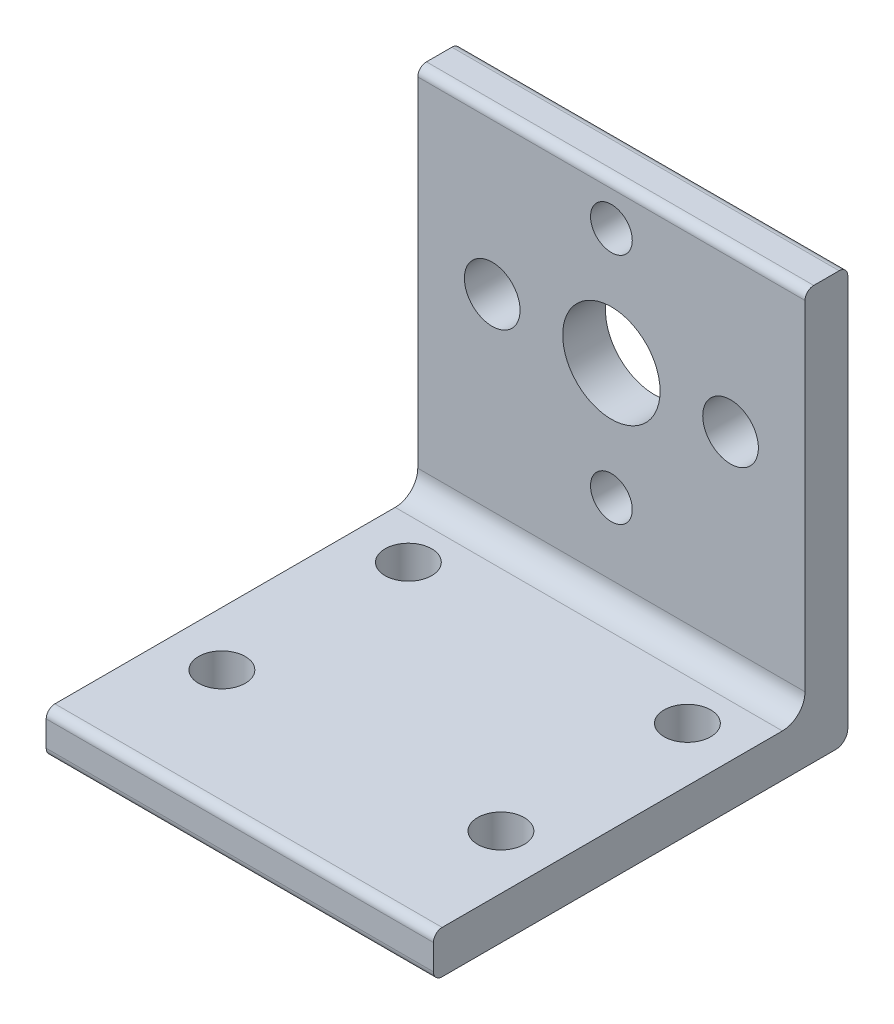
ISO-10303-21;
HEADER;
FILE_DESCRIPTION(('STEP AP214'),'2;1');
FILE_NAME('part.step','',(''),(''),'','','');
FILE_SCHEMA(('AUTOMOTIVE_DESIGN { 1 0 10303 214 1 1 1 1 }'));
ENDSEC;
DATA;
#1=APPLICATION_CONTEXT('core data for automotive mechanical design processes');
#2=APPLICATION_PROTOCOL_DEFINITION('international standard','automotive_design',2000,#1);
#3=PRODUCT_CONTEXT('',#1,'mechanical');
#4=PRODUCT('Part','Part','',(#3));
#5=PRODUCT_RELATED_PRODUCT_CATEGORY('part','',(#4));
#6=PRODUCT_DEFINITION_FORMATION('','',#4);
#7=PRODUCT_DEFINITION_CONTEXT('part definition',#1,'design');
#8=PRODUCT_DEFINITION('design','',#6,#7);
#9=PRODUCT_DEFINITION_SHAPE('','',#8);
#10=(LENGTH_UNIT() NAMED_UNIT(*) SI_UNIT(.MILLI.,.METRE.));
#11=(NAMED_UNIT(*) PLANE_ANGLE_UNIT() SI_UNIT($,.RADIAN.));
#12=(NAMED_UNIT(*) SI_UNIT($,.STERADIAN.) SOLID_ANGLE_UNIT());
#13=UNCERTAINTY_MEASURE_WITH_UNIT(LENGTH_MEASURE(1.E-05),#10,'distance_accuracy_value','');
#14=(GEOMETRIC_REPRESENTATION_CONTEXT(3) GLOBAL_UNCERTAINTY_ASSIGNED_CONTEXT((#13)) GLOBAL_UNIT_ASSIGNED_CONTEXT((#10,
#11,#12)) REPRESENTATION_CONTEXT('',''));
#15=CARTESIAN_POINT('',(0.,0.,0.));
#16=DIRECTION('',(0.,0.,1.));
#17=DIRECTION('',(1.,0.,0.));
#18=AXIS2_PLACEMENT_3D('',#15,#16,#17);
#19=CARTESIAN_POINT('',(28.2702,0.,3.1242));
#20=DIRECTION('',(0.,-1.,0.));
#21=DIRECTION('',(0.,0.,-1.));
#22=AXIS2_PLACEMENT_3D('',#19,#20,#21);
#23=PLANE('',#22);
#24=DIRECTION('',(0.,0.,1.));
#25=VECTOR('',#24,1.);
#26=CARTESIAN_POINT('',(28.2702,0.,3.1242));
#27=LINE('',#26,#25);
#28=CARTESIAN_POINT('',(28.2702,0.,0.635));
#29=VERTEX_POINT('',#28);
#30=CARTESIAN_POINT('',(28.2702,0.,2.4892));
#31=VERTEX_POINT('',#30);
#32=EDGE_CURVE('E192',#29,#31,#27,.T.);
#33=ORIENTED_EDGE('',*,*,#32,.F.);
#34=DIRECTION('',(-1.,0.,0.));
#35=VECTOR('',#34,1.);
#36=CARTESIAN_POINT('',(28.2702,0.,0.635));
#37=LINE('',#36,#35);
#38=CARTESIAN_POINT('',(0.,0.,0.635));
#39=VERTEX_POINT('',#38);
#40=EDGE_CURVE('E239',#29,#39,#37,.T.);
#41=ORIENTED_EDGE('',*,*,#40,.T.);
#42=DIRECTION('',(0.,0.,1.));
#43=VECTOR('',#42,1.);
#44=CARTESIAN_POINT('',(0.,0.,3.1242));
#45=LINE('',#44,#43);
#46=CARTESIAN_POINT('',(0.,0.,2.4892));
#47=VERTEX_POINT('',#46);
#48=EDGE_CURVE('E184',#39,#47,#45,.T.);
#49=ORIENTED_EDGE('',*,*,#48,.T.);
#50=DIRECTION('',(-1.,0.,0.));
#51=VECTOR('',#50,1.);
#52=CARTESIAN_POINT('',(28.2702,0.,2.4892));
#53=LINE('',#52,#51);
#54=EDGE_CURVE('E236',#47,#31,#53,.F.);
#55=ORIENTED_EDGE('',*,*,#54,.T.);
#56=EDGE_LOOP('',(#33,#41,#49,#55));
#57=FACE_BOUND('',#56,.T.);
#58=ADVANCED_FACE('F50',(#57),#23,.F.);
#59=CARTESIAN_POINT('',(28.2702,-27.0256,3.1242));
#60=DIRECTION('',(0.,0.,-1.));
#61=DIRECTION('',(0.,1.,0.));
#62=AXIS2_PLACEMENT_3D('',#59,#60,#61);
#63=PLANE('',#62);
#64=CARTESIAN_POINT('',(14.1351,-3.1496,3.1242));
#65=DIRECTION('',(0.,0.,1.));
#66=DIRECTION('',(1.,0.,0.));
#67=AXIS2_PLACEMENT_3D('',#64,#65,#66);
#68=CIRCLE('',#67,1.524);
#69=CARTESIAN_POINT('',(15.6591,-3.1496,3.1242));
#70=VERTEX_POINT('',#69);
#71=EDGE_CURVE('E280',#70,#70,#68,.T.);
#72=ORIENTED_EDGE('',*,*,#71,.F.);
#73=EDGE_LOOP('',(#72));
#74=FACE_BOUND('',#73,.T.);
#75=CARTESIAN_POINT('',(5.4356,-11.6586,3.1242));
#76=DIRECTION('',(0.,0.,1.));
#77=DIRECTION('',(1.,0.,0.));
#78=AXIS2_PLACEMENT_3D('',#75,#76,#77);
#79=CIRCLE('',#78,2.032);
#80=CARTESIAN_POINT('',(7.4676,-11.6586,3.1242));
#81=VERTEX_POINT('',#80);
#82=EDGE_CURVE('E286',#81,#81,#79,.T.);
#83=ORIENTED_EDGE('',*,*,#82,.F.);
#84=EDGE_LOOP('',(#83));
#85=FACE_BOUND('',#84,.T.);
#86=CARTESIAN_POINT('',(22.8346,-11.6586,3.1242));
#87=DIRECTION('',(0.,0.,1.));
#88=DIRECTION('',(-1.,0.,0.));
#89=AXIS2_PLACEMENT_3D('',#86,#87,#88);
#90=CIRCLE('',#89,2.032);
#91=CARTESIAN_POINT('',(20.8026,-11.6586,3.1242));
#92=VERTEX_POINT('',#91);
#93=EDGE_CURVE('E287',#92,#92,#90,.T.);
#94=ORIENTED_EDGE('',*,*,#93,.F.);
#95=EDGE_LOOP('',(#94));
#96=FACE_BOUND('',#95,.T.);
#97=CARTESIAN_POINT('',(14.1351,-20.1676,3.1242));
#98=DIRECTION('',(0.,0.,1.));
#99=DIRECTION('',(-1.,0.,0.));
#100=AXIS2_PLACEMENT_3D('',#97,#98,#99);
#101=CIRCLE('',#100,1.524);
#102=CARTESIAN_POINT('',(12.6111,-20.1676,3.1242));
#103=VERTEX_POINT('',#102);
#104=EDGE_CURVE('E301',#103,#103,#101,.T.);
#105=ORIENTED_EDGE('',*,*,#104,.F.);
#106=EDGE_LOOP('',(#105));
#107=FACE_BOUND('',#106,.T.);
#108=CARTESIAN_POINT('',(14.1351,-11.6586,3.1242));
#109=DIRECTION('',(0.,0.,1.));
#110=DIRECTION('',(1.,0.,0.));
#111=AXIS2_PLACEMENT_3D('',#108,#109,#110);
#112=CIRCLE('',#111,3.556);
#113=CARTESIAN_POINT('',(17.6911,-11.6586,3.1242));
#114=VERTEX_POINT('',#113);
#115=EDGE_CURVE('E268',#114,#114,#112,.T.);
#116=ORIENTED_EDGE('',*,*,#115,.F.);
#117=EDGE_LOOP('',(#116));
#118=FACE_BOUND('',#117,.T.);
#119=DIRECTION('',(0.,-1.,0.));
#120=VECTOR('',#119,1.);
#121=CARTESIAN_POINT('',(28.2702,-27.0256,3.1242));
#122=LINE('',#121,#120);
#123=CARTESIAN_POINT('',(28.2702,-0.635,3.1242));
#124=VERTEX_POINT('',#123);
#125=CARTESIAN_POINT('',(28.2702,-25.3746,3.1242));
#126=VERTEX_POINT('',#125);
#127=EDGE_CURVE('E275',#124,#126,#122,.T.);
#128=ORIENTED_EDGE('',*,*,#127,.F.);
#129=DIRECTION('',(-1.,0.,0.));
#130=VECTOR('',#129,1.);
#131=CARTESIAN_POINT('',(28.2702,-0.635,3.1242));
#132=LINE('',#131,#130);
#133=CARTESIAN_POINT('',(0.,-0.635,3.1242));
#134=VERTEX_POINT('',#133);
#135=EDGE_CURVE('E11',#124,#134,#132,.T.);
#136=ORIENTED_EDGE('',*,*,#135,.T.);
#137=DIRECTION('',(0.,-1.,0.));
#138=VECTOR('',#137,1.);
#139=CARTESIAN_POINT('',(0.,-27.0256,3.1242));
#140=LINE('',#139,#138);
#141=CARTESIAN_POINT('',(0.,-25.3746,3.1242));
#142=VERTEX_POINT('',#141);
#143=EDGE_CURVE('E177',#134,#142,#140,.T.);
#144=ORIENTED_EDGE('',*,*,#143,.T.);
#145=DIRECTION('',(-1.,0.,0.));
#146=VECTOR('',#145,1.);
#147=CARTESIAN_POINT('',(28.2702,-25.3746,3.1242));
#148=LINE('',#147,#146);
#149=EDGE_CURVE('E158',#142,#126,#148,.F.);
#150=ORIENTED_EDGE('',*,*,#149,.T.);
#151=EDGE_LOOP('',(#128,#136,#144,#150));
#152=FACE_BOUND('',#151,.T.);
#153=ADVANCED_FACE('F342',(#74,#85,#96,#107,#118,#152),#63,.F.);
#154=CARTESIAN_POINT('',(28.2702,-27.0256,30.2514));
#155=DIRECTION('',(0.,-1.,0.));
#156=DIRECTION('',(0.,0.,-1.));
#157=AXIS2_PLACEMENT_3D('',#154,#155,#156);
#158=PLANE('',#157);
#159=CARTESIAN_POINT('',(24.3205,-27.0256,21.3741));
#160=DIRECTION('',(0.,1.,0.));
#161=DIRECTION('',(0.,0.,-1.));
#162=AXIS2_PLACEMENT_3D('',#159,#160,#161);
#163=CIRCLE('',#162,1.7018);
#164=CARTESIAN_POINT('',(24.3205,-27.0256,23.0759));
#165=VERTEX_POINT('',#164);
#166=EDGE_CURVE('E320',#165,#165,#163,.T.);
#167=ORIENTED_EDGE('',*,*,#166,.F.);
#168=EDGE_LOOP('',(#167));
#169=FACE_BOUND('',#168,.T.);
#170=CARTESIAN_POINT('',(3.9497,-27.0256,21.3741));
#171=DIRECTION('',(0.,1.,0.));
#172=DIRECTION('',(0.,0.,1.));
#173=AXIS2_PLACEMENT_3D('',#170,#171,#172);
#174=CIRCLE('',#173,1.7018);
#175=CARTESIAN_POINT('',(3.9497,-27.0256,23.0759));
#176=VERTEX_POINT('',#175);
#177=EDGE_CURVE('E326',#176,#176,#174,.T.);
#178=ORIENTED_EDGE('',*,*,#177,.F.);
#179=EDGE_LOOP('',(#178));
#180=FACE_BOUND('',#179,.T.);
#181=CARTESIAN_POINT('',(3.9497,-27.0256,7.7597));
#182=DIRECTION('',(0.,1.,0.));
#183=DIRECTION('',(0.,0.,-1.));
#184=AXIS2_PLACEMENT_3D('',#181,#182,#183);
#185=CIRCLE('',#184,1.7018);
#186=CARTESIAN_POINT('',(3.9497,-27.0256,9.4615));
#187=VERTEX_POINT('',#186);
#188=EDGE_CURVE('E314',#187,#187,#185,.T.);
#189=ORIENTED_EDGE('',*,*,#188,.F.);
#190=EDGE_LOOP('',(#189));
#191=FACE_BOUND('',#190,.T.);
#192=CARTESIAN_POINT('',(24.3205,-27.0256,7.7597));
#193=DIRECTION('',(0.,1.,0.));
#194=DIRECTION('',(0.,0.,1.));
#195=AXIS2_PLACEMENT_3D('',#192,#193,#194);
#196=CIRCLE('',#195,1.7018);
#197=CARTESIAN_POINT('',(24.3205,-27.0256,9.4615));
#198=VERTEX_POINT('',#197);
#199=EDGE_CURVE('E311',#198,#198,#196,.T.);
#200=ORIENTED_EDGE('',*,*,#199,.F.);
#201=EDGE_LOOP('',(#200));
#202=FACE_BOUND('',#201,.T.);
#203=DIRECTION('',(0.,0.,1.));
#204=VECTOR('',#203,1.);
#205=CARTESIAN_POINT('',(0.,-27.0256,30.2514));
#206=LINE('',#205,#204);
#207=CARTESIAN_POINT('',(0.,-27.0256,4.7752));
#208=VERTEX_POINT('',#207);
#209=CARTESIAN_POINT('',(0.,-27.0256,29.6164));
#210=VERTEX_POINT('',#209);
#211=EDGE_CURVE('E166',#208,#210,#206,.T.);
#212=ORIENTED_EDGE('',*,*,#211,.T.);
#213=DIRECTION('',(-1.,0.,0.));
#214=VECTOR('',#213,1.);
#215=CARTESIAN_POINT('',(28.2702,-27.0256,29.6164));
#216=LINE('',#215,#214);
#217=CARTESIAN_POINT('',(28.2702,-27.0256,29.6164));
#218=VERTEX_POINT('',#217);
#219=EDGE_CURVE('E66',#210,#218,#216,.F.);
#220=ORIENTED_EDGE('',*,*,#219,.T.);
#221=DIRECTION('',(0.,0.,1.));
#222=VECTOR('',#221,1.);
#223=CARTESIAN_POINT('',(28.2702,-27.0256,30.2514));
#224=LINE('',#223,#222);
#225=CARTESIAN_POINT('',(28.2702,-27.0256,4.7752));
#226=VERTEX_POINT('',#225);
#227=EDGE_CURVE('E167',#226,#218,#224,.T.);
#228=ORIENTED_EDGE('',*,*,#227,.F.);
#229=DIRECTION('',(-1.,0.,0.));
#230=VECTOR('',#229,1.);
#231=CARTESIAN_POINT('',(0.,-27.0256,4.7752));
#232=LINE('',#231,#230);
#233=EDGE_CURVE('E156',#226,#208,#232,.T.);
#234=ORIENTED_EDGE('',*,*,#233,.T.);
#235=EDGE_LOOP('',(#212,#220,#228,#234));
#236=FACE_BOUND('',#235,.T.);
#237=ADVANCED_FACE('F165',(#169,#180,#191,#202,#236),#158,.F.);
#238=CARTESIAN_POINT('',(28.2702,-30.1498,30.2514));
#239=DIRECTION('',(0.,0.,-1.));
#240=DIRECTION('',(-1.,0.,0.));
#241=AXIS2_PLACEMENT_3D('',#238,#239,#240);
#242=PLANE('',#241);
#243=DIRECTION('',(0.,-1.,0.));
#244=VECTOR('',#243,1.);
#245=CARTESIAN_POINT('',(0.,-30.1498,30.2514));
#246=LINE('',#245,#244);
#247=CARTESIAN_POINT('',(0.,-27.6606,30.2514));
#248=VERTEX_POINT('',#247);
#249=CARTESIAN_POINT('',(0.,-29.5148,30.2514));
#250=VERTEX_POINT('',#249);
#251=EDGE_CURVE('E176',#248,#250,#246,.T.);
#252=ORIENTED_EDGE('',*,*,#251,.T.);
#253=DIRECTION('',(-1.,0.,0.));
#254=VECTOR('',#253,1.);
#255=CARTESIAN_POINT('',(28.2702,-29.5148,30.2514));
#256=LINE('',#255,#254);
#257=CARTESIAN_POINT('',(28.2702,-29.5148,30.2514));
#258=VERTEX_POINT('',#257);
#259=EDGE_CURVE('E226',#250,#258,#256,.F.);
#260=ORIENTED_EDGE('',*,*,#259,.T.);
#261=DIRECTION('',(0.,-1.,0.));
#262=VECTOR('',#261,1.);
#263=CARTESIAN_POINT('',(28.2702,-30.1498,30.2514));
#264=LINE('',#263,#262);
#265=CARTESIAN_POINT('',(28.2702,-27.6606,30.2514));
#266=VERTEX_POINT('',#265);
#267=EDGE_CURVE('E272',#266,#258,#264,.T.);
#268=ORIENTED_EDGE('',*,*,#267,.F.);
#269=DIRECTION('',(-1.,0.,0.));
#270=VECTOR('',#269,1.);
#271=CARTESIAN_POINT('',(28.2702,-27.6606,30.2514));
#272=LINE('',#271,#270);
#273=EDGE_CURVE('E223',#266,#248,#272,.T.);
#274=ORIENTED_EDGE('',*,*,#273,.T.);
#275=EDGE_LOOP('',(#252,#260,#268,#274));
#276=FACE_BOUND('',#275,.T.);
#277=ADVANCED_FACE('F341',(#276),#242,.F.);
#278=CARTESIAN_POINT('',(28.2702,-30.1498,0.));
#279=DIRECTION('',(0.,1.,0.));
#280=DIRECTION('',(0.,0.,1.));
#281=AXIS2_PLACEMENT_3D('',#278,#279,#280);
#282=PLANE('',#281);
#283=CARTESIAN_POINT('',(24.3205,-30.1498,21.3741));
#284=DIRECTION('',(0.,1.,0.));
#285=DIRECTION('',(0.,0.,-1.));
#286=AXIS2_PLACEMENT_3D('',#283,#284,#285);
#287=CIRCLE('',#286,1.7018);
#288=CARTESIAN_POINT('',(24.3205,-30.1498,23.0759));
#289=VERTEX_POINT('',#288);
#290=EDGE_CURVE('E317',#289,#289,#287,.T.);
#291=ORIENTED_EDGE('',*,*,#290,.T.);
#292=EDGE_LOOP('',(#291));
#293=FACE_BOUND('',#292,.T.);
#294=CARTESIAN_POINT('',(3.9497,-30.1498,21.3741));
#295=DIRECTION('',(0.,1.,0.));
#296=DIRECTION('',(0.,0.,1.));
#297=AXIS2_PLACEMENT_3D('',#294,#295,#296);
#298=CIRCLE('',#297,1.7018);
#299=CARTESIAN_POINT('',(3.9497,-30.1498,23.0759));
#300=VERTEX_POINT('',#299);
#301=EDGE_CURVE('E323',#300,#300,#298,.T.);
#302=ORIENTED_EDGE('',*,*,#301,.T.);
#303=EDGE_LOOP('',(#302));
#304=FACE_BOUND('',#303,.T.);
#305=CARTESIAN_POINT('',(3.9497,-30.1498,7.7597));
#306=DIRECTION('',(0.,1.,0.));
#307=DIRECTION('',(0.,0.,-1.));
#308=AXIS2_PLACEMENT_3D('',#305,#306,#307);
#309=CIRCLE('',#308,1.7018);
#310=CARTESIAN_POINT('',(3.9497,-30.1498,9.4615));
#311=VERTEX_POINT('',#310);
#312=EDGE_CURVE('E329',#311,#311,#309,.T.);
#313=ORIENTED_EDGE('',*,*,#312,.T.);
#314=EDGE_LOOP('',(#313));
#315=FACE_BOUND('',#314,.T.);
#316=CARTESIAN_POINT('',(24.3205,-30.1498,7.7597));
#317=DIRECTION('',(0.,1.,0.));
#318=DIRECTION('',(0.,0.,1.));
#319=AXIS2_PLACEMENT_3D('',#316,#317,#318);
#320=CIRCLE('',#319,1.7018);
#321=CARTESIAN_POINT('',(24.3205,-30.1498,9.4615));
#322=VERTEX_POINT('',#321);
#323=EDGE_CURVE('E302',#322,#322,#320,.T.);
#324=ORIENTED_EDGE('',*,*,#323,.T.);
#325=EDGE_LOOP('',(#324));
#326=FACE_BOUND('',#325,.T.);
#327=DIRECTION('',(0.,0.,-1.));
#328=VECTOR('',#327,1.);
#329=CARTESIAN_POINT('',(28.2702,-30.1498,0.));
#330=LINE('',#329,#328);
#331=CARTESIAN_POINT('',(28.2702,-30.1498,29.6164));
#332=VERTEX_POINT('',#331);
#333=CARTESIAN_POINT('',(28.2702,-30.1498,0.888999999999996));
#334=VERTEX_POINT('',#333);
#335=EDGE_CURVE('E256',#332,#334,#330,.T.);
#336=ORIENTED_EDGE('',*,*,#335,.F.);
#337=DIRECTION('',(-1.,0.,0.));
#338=VECTOR('',#337,1.);
#339=CARTESIAN_POINT('',(28.2702,-30.1498,29.6164));
#340=LINE('',#339,#338);
#341=CARTESIAN_POINT('',(0.,-30.1498,29.6164));
#342=VERTEX_POINT('',#341);
#343=EDGE_CURVE('E211',#332,#342,#340,.T.);
#344=ORIENTED_EDGE('',*,*,#343,.T.);
#345=DIRECTION('',(0.,0.,-1.));
#346=VECTOR('',#345,1.);
#347=CARTESIAN_POINT('',(0.,-30.1498,0.));
#348=LINE('',#347,#346);
#349=CARTESIAN_POINT('',(0.,-30.1498,0.888999999999996));
#350=VERTEX_POINT('',#349);
#351=EDGE_CURVE('E181',#342,#350,#348,.T.);
#352=ORIENTED_EDGE('',*,*,#351,.T.);
#353=DIRECTION('',(-1.,0.,0.));
#354=VECTOR('',#353,1.);
#355=CARTESIAN_POINT('',(28.2702,-30.1498,0.888999999999996));
#356=LINE('',#355,#354);
#357=EDGE_CURVE('E205',#350,#334,#356,.F.);
#358=ORIENTED_EDGE('',*,*,#357,.T.);
#359=EDGE_LOOP('',(#336,#344,#352,#358));
#360=FACE_BOUND('',#359,.T.);
#361=ADVANCED_FACE('F405',(#293,#304,#315,#326,#360),#282,.F.);
#362=CARTESIAN_POINT('',(28.2702,0.,0.));
#363=DIRECTION('',(0.,0.,1.));
#364=DIRECTION('',(0.,-1.,0.));
#365=AXIS2_PLACEMENT_3D('',#362,#363,#364);
#366=PLANE('',#365);
#367=CARTESIAN_POINT('',(14.1351,-3.1496,0.));
#368=DIRECTION('',(0.,0.,1.));
#369=DIRECTION('',(1.,0.,0.));
#370=AXIS2_PLACEMENT_3D('',#367,#368,#369);
#371=CIRCLE('',#370,1.524);
#372=CARTESIAN_POINT('',(15.6591,-3.1496,0.));
#373=VERTEX_POINT('',#372);
#374=EDGE_CURVE('E291',#373,#373,#371,.T.);
#375=ORIENTED_EDGE('',*,*,#374,.T.);
#376=EDGE_LOOP('',(#375));
#377=FACE_BOUND('',#376,.T.);
#378=CARTESIAN_POINT('',(5.4356,-11.6586,0.));
#379=DIRECTION('',(0.,0.,1.));
#380=DIRECTION('',(1.,0.,0.));
#381=AXIS2_PLACEMENT_3D('',#378,#379,#380);
#382=CIRCLE('',#381,2.032);
#383=CARTESIAN_POINT('',(7.4676,-11.6586,0.));
#384=VERTEX_POINT('',#383);
#385=EDGE_CURVE('E282',#384,#384,#382,.T.);
#386=ORIENTED_EDGE('',*,*,#385,.T.);
#387=EDGE_LOOP('',(#386));
#388=FACE_BOUND('',#387,.T.);
#389=CARTESIAN_POINT('',(22.8346,-11.6586,0.));
#390=DIRECTION('',(0.,0.,1.));
#391=DIRECTION('',(-1.,0.,0.));
#392=AXIS2_PLACEMENT_3D('',#389,#390,#391);
#393=CIRCLE('',#392,2.032);
#394=CARTESIAN_POINT('',(20.8026,-11.6586,0.));
#395=VERTEX_POINT('',#394);
#396=EDGE_CURVE('E306',#395,#395,#393,.T.);
#397=ORIENTED_EDGE('',*,*,#396,.T.);
#398=EDGE_LOOP('',(#397));
#399=FACE_BOUND('',#398,.T.);
#400=CARTESIAN_POINT('',(14.1351,-20.1676,0.));
#401=DIRECTION('',(0.,0.,1.));
#402=DIRECTION('',(-1.,0.,0.));
#403=AXIS2_PLACEMENT_3D('',#400,#401,#402);
#404=CIRCLE('',#403,1.524);
#405=CARTESIAN_POINT('',(12.6111,-20.1676,0.));
#406=VERTEX_POINT('',#405);
#407=EDGE_CURVE('E297',#406,#406,#404,.T.);
#408=ORIENTED_EDGE('',*,*,#407,.T.);
#409=EDGE_LOOP('',(#408));
#410=FACE_BOUND('',#409,.T.);
#411=CARTESIAN_POINT('',(14.1351,-11.6586,0.));
#412=DIRECTION('',(0.,0.,1.));
#413=DIRECTION('',(1.,0.,0.));
#414=AXIS2_PLACEMENT_3D('',#411,#412,#413);
#415=CIRCLE('',#414,3.556);
#416=CARTESIAN_POINT('',(17.6911,-11.6586,0.));
#417=VERTEX_POINT('',#416);
#418=EDGE_CURVE('E265',#417,#417,#415,.T.);
#419=ORIENTED_EDGE('',*,*,#418,.T.);
#420=EDGE_LOOP('',(#419));
#421=FACE_BOUND('',#420,.T.);
#422=DIRECTION('',(0.,1.,0.));
#423=VECTOR('',#422,1.);
#424=CARTESIAN_POINT('',(0.,0.,0.));
#425=LINE('',#424,#423);
#426=CARTESIAN_POINT('',(0.,-29.2608,0.));
#427=VERTEX_POINT('',#426);
#428=CARTESIAN_POINT('',(0.,-0.635,0.));
#429=VERTEX_POINT('',#428);
#430=EDGE_CURVE('E190',#427,#429,#425,.T.);
#431=ORIENTED_EDGE('',*,*,#430,.T.);
#432=DIRECTION('',(-1.,0.,0.));
#433=VECTOR('',#432,1.);
#434=CARTESIAN_POINT('',(28.2702,-0.635,0.));
#435=LINE('',#434,#433);
#436=CARTESIAN_POINT('',(28.2702,-0.635,0.));
#437=VERTEX_POINT('',#436);
#438=EDGE_CURVE('E59',#429,#437,#435,.F.);
#439=ORIENTED_EDGE('',*,*,#438,.T.);
#440=DIRECTION('',(0.,1.,0.));
#441=VECTOR('',#440,1.);
#442=CARTESIAN_POINT('',(28.2702,0.,0.));
#443=LINE('',#442,#441);
#444=CARTESIAN_POINT('',(28.2702,-29.2608,0.));
#445=VERTEX_POINT('',#444);
#446=EDGE_CURVE('E169',#445,#437,#443,.T.);
#447=ORIENTED_EDGE('',*,*,#446,.F.);
#448=DIRECTION('',(-1.,0.,0.));
#449=VECTOR('',#448,1.);
#450=CARTESIAN_POINT('',(28.2702,-29.2608,0.));
#451=LINE('',#450,#449);
#452=EDGE_CURVE('E197',#445,#427,#451,.T.);
#453=ORIENTED_EDGE('',*,*,#452,.T.);
#454=EDGE_LOOP('',(#431,#439,#447,#453));
#455=FACE_BOUND('',#454,.T.);
#456=ADVANCED_FACE('F247',(#377,#388,#399,#410,#421,#455),#366,.F.);
#457=CARTESIAN_POINT('',(28.2702,0.,0.));
#458=DIRECTION('',(-1.,0.,0.));
#459=DIRECTION('',(0.,0.,1.));
#460=AXIS2_PLACEMENT_3D('',#457,#458,#459);
#461=PLANE('',#460);
#462=ORIENTED_EDGE('',*,*,#267,.T.);
#463=CARTESIAN_POINT('',(28.2702,-29.5148,29.6164));
#464=DIRECTION('',(-1.,0.,0.));
#465=DIRECTION('',(0.,0.,1.));
#466=AXIS2_PLACEMENT_3D('',#463,#464,#465);
#467=CIRCLE('',#466,0.635);
#468=EDGE_CURVE('E233',#258,#332,#467,.F.);
#469=ORIENTED_EDGE('',*,*,#468,.T.);
#470=ORIENTED_EDGE('',*,*,#335,.T.);
#471=CARTESIAN_POINT('',(28.2702,-29.2608,0.888999999999996));
#472=DIRECTION('',(-1.,0.,0.));
#473=DIRECTION('',(0.,0.,1.));
#474=AXIS2_PLACEMENT_3D('',#471,#472,#473);
#475=CIRCLE('',#474,0.889);
#476=EDGE_CURVE('E209',#334,#445,#475,.F.);
#477=ORIENTED_EDGE('',*,*,#476,.T.);
#478=ORIENTED_EDGE('',*,*,#446,.T.);
#479=CARTESIAN_POINT('',(28.2702,-0.635,0.635));
#480=DIRECTION('',(-1.,0.,0.));
#481=DIRECTION('',(0.,0.,1.));
#482=AXIS2_PLACEMENT_3D('',#479,#480,#481);
#483=CIRCLE('',#482,0.635);
#484=EDGE_CURVE('E229',#437,#29,#483,.F.);
#485=ORIENTED_EDGE('',*,*,#484,.T.);
#486=ORIENTED_EDGE('',*,*,#32,.T.);
#487=CARTESIAN_POINT('',(28.2702,-0.635,2.4892));
#488=DIRECTION('',(-1.,0.,0.));
#489=DIRECTION('',(0.,0.,1.));
#490=AXIS2_PLACEMENT_3D('',#487,#488,#489);
#491=CIRCLE('',#490,0.635);
#492=EDGE_CURVE('E74',#31,#124,#491,.F.);
#493=ORIENTED_EDGE('',*,*,#492,.T.);
#494=ORIENTED_EDGE('',*,*,#127,.T.);
#495=CARTESIAN_POINT('',(28.2702,-25.3746,4.7752));
#496=DIRECTION('',(-1.,0.,0.));
#497=DIRECTION('',(0.,0.,1.));
#498=AXIS2_PLACEMENT_3D('',#495,#496,#497);
#499=CIRCLE('',#498,1.651);
#500=EDGE_CURVE('E163',#126,#226,#499,.T.);
#501=ORIENTED_EDGE('',*,*,#500,.T.);
#502=ORIENTED_EDGE('',*,*,#227,.T.);
#503=CARTESIAN_POINT('',(28.2702,-27.6606,29.6164));
#504=DIRECTION('',(-1.,0.,0.));
#505=DIRECTION('',(0.,0.,1.));
#506=AXIS2_PLACEMENT_3D('',#503,#504,#505);
#507=CIRCLE('',#506,0.635);
#508=EDGE_CURVE('E231',#218,#266,#507,.F.);
#509=ORIENTED_EDGE('',*,*,#508,.T.);
#510=EDGE_LOOP('',(#462,#469,#470,#477,#478,#485,#486,#493,#494,#501,#502,#509));
#511=FACE_BOUND('',#510,.T.);
#512=ADVANCED_FACE('F253',(#511),#461,.F.);
#513=CARTESIAN_POINT('',(0.,0.,0.));
#514=DIRECTION('',(-1.,0.,0.));
#515=DIRECTION('',(0.,0.,1.));
#516=AXIS2_PLACEMENT_3D('',#513,#514,#515);
#517=PLANE('',#516);
#518=ORIENTED_EDGE('',*,*,#351,.F.);
#519=CARTESIAN_POINT('',(0.,-29.5148,29.6164));
#520=DIRECTION('',(-1.,0.,0.));
#521=DIRECTION('',(0.,0.,1.));
#522=AXIS2_PLACEMENT_3D('',#519,#520,#521);
#523=CIRCLE('',#522,0.635);
#524=EDGE_CURVE('E221',#342,#250,#523,.T.);
#525=ORIENTED_EDGE('',*,*,#524,.T.);
#526=ORIENTED_EDGE('',*,*,#251,.F.);
#527=CARTESIAN_POINT('',(0.,-27.6606,29.6164));
#528=DIRECTION('',(-1.,0.,0.));
#529=DIRECTION('',(0.,0.,1.));
#530=AXIS2_PLACEMENT_3D('',#527,#528,#529);
#531=CIRCLE('',#530,0.635);
#532=EDGE_CURVE('E174',#248,#210,#531,.T.);
#533=ORIENTED_EDGE('',*,*,#532,.T.);
#534=ORIENTED_EDGE('',*,*,#211,.F.);
#535=CARTESIAN_POINT('',(0.,-25.3746,4.7752));
#536=DIRECTION('',(-1.,0.,0.));
#537=DIRECTION('',(0.,0.,1.));
#538=AXIS2_PLACEMENT_3D('',#535,#536,#537);
#539=CIRCLE('',#538,1.651);
#540=EDGE_CURVE('E152',#208,#142,#539,.F.);
#541=ORIENTED_EDGE('',*,*,#540,.T.);
#542=ORIENTED_EDGE('',*,*,#143,.F.);
#543=CARTESIAN_POINT('',(0.,-0.635,2.4892));
#544=DIRECTION('',(-1.,0.,0.));
#545=DIRECTION('',(0.,0.,1.));
#546=AXIS2_PLACEMENT_3D('',#543,#544,#545);
#547=CIRCLE('',#546,0.635);
#548=EDGE_CURVE('E214',#134,#47,#547,.T.);
#549=ORIENTED_EDGE('',*,*,#548,.T.);
#550=ORIENTED_EDGE('',*,*,#48,.F.);
#551=CARTESIAN_POINT('',(0.,-0.635,0.635));
#552=DIRECTION('',(-1.,0.,0.));
#553=DIRECTION('',(0.,0.,1.));
#554=AXIS2_PLACEMENT_3D('',#551,#552,#553);
#555=CIRCLE('',#554,0.635);
#556=EDGE_CURVE('E217',#39,#429,#555,.T.);
#557=ORIENTED_EDGE('',*,*,#556,.T.);
#558=ORIENTED_EDGE('',*,*,#430,.F.);
#559=CARTESIAN_POINT('',(0.,-29.2608,0.888999999999996));
#560=DIRECTION('',(-1.,0.,0.));
#561=DIRECTION('',(0.,0.,1.));
#562=AXIS2_PLACEMENT_3D('',#559,#560,#561);
#563=CIRCLE('',#562,0.889);
#564=EDGE_CURVE('E201',#427,#350,#563,.T.);
#565=ORIENTED_EDGE('',*,*,#564,.T.);
#566=EDGE_LOOP('',(#518,#525,#526,#533,#534,#541,#542,#549,#550,#557,#558,#565));
#567=FACE_BOUND('',#566,.T.);
#568=ADVANCED_FACE('F172',(#567),#517,.T.);
#569=CARTESIAN_POINT('',(14.1351,-11.6586,0.));
#570=DIRECTION('',(0.,0.,1.));
#571=DIRECTION('',(1.,0.,0.));
#572=AXIS2_PLACEMENT_3D('',#569,#570,#571);
#573=CYLINDRICAL_SURFACE('',#572,3.556);
#574=ORIENTED_EDGE('',*,*,#418,.F.);
#575=EDGE_LOOP('',(#574));
#576=FACE_BOUND('',#575,.T.);
#577=ORIENTED_EDGE('',*,*,#115,.T.);
#578=EDGE_LOOP('',(#577));
#579=FACE_BOUND('',#578,.T.);
#580=ADVANCED_FACE('F421',(#576,#579),#573,.F.);
#581=CARTESIAN_POINT('',(14.1351,-20.1676,0.));
#582=DIRECTION('',(0.,0.,1.));
#583=DIRECTION('',(1.,0.,0.));
#584=AXIS2_PLACEMENT_3D('',#581,#582,#583);
#585=CYLINDRICAL_SURFACE('',#584,1.524);
#586=ORIENTED_EDGE('',*,*,#407,.F.);
#587=EDGE_LOOP('',(#586));
#588=FACE_BOUND('',#587,.T.);
#589=ORIENTED_EDGE('',*,*,#104,.T.);
#590=EDGE_LOOP('',(#589));
#591=FACE_BOUND('',#590,.T.);
#592=ADVANCED_FACE('F426',(#588,#591),#585,.F.);
#593=CARTESIAN_POINT('',(22.8346,-11.6586,0.));
#594=DIRECTION('',(0.,0.,1.));
#595=DIRECTION('',(1.,0.,0.));
#596=AXIS2_PLACEMENT_3D('',#593,#594,#595);
#597=CYLINDRICAL_SURFACE('',#596,2.032);
#598=ORIENTED_EDGE('',*,*,#396,.F.);
#599=EDGE_LOOP('',(#598));
#600=FACE_BOUND('',#599,.T.);
#601=ORIENTED_EDGE('',*,*,#93,.T.);
#602=EDGE_LOOP('',(#601));
#603=FACE_BOUND('',#602,.T.);
#604=ADVANCED_FACE('F429',(#600,#603),#597,.F.);
#605=CARTESIAN_POINT('',(5.4356,-11.6586,0.));
#606=DIRECTION('',(0.,0.,1.));
#607=DIRECTION('',(1.,0.,0.));
#608=AXIS2_PLACEMENT_3D('',#605,#606,#607);
#609=CYLINDRICAL_SURFACE('',#608,2.032);
#610=ORIENTED_EDGE('',*,*,#385,.F.);
#611=EDGE_LOOP('',(#610));
#612=FACE_BOUND('',#611,.T.);
#613=ORIENTED_EDGE('',*,*,#82,.T.);
#614=EDGE_LOOP('',(#613));
#615=FACE_BOUND('',#614,.T.);
#616=ADVANCED_FACE('F359',(#612,#615),#609,.F.);
#617=CARTESIAN_POINT('',(14.1351,-3.1496,0.));
#618=DIRECTION('',(0.,0.,1.));
#619=DIRECTION('',(1.,0.,0.));
#620=AXIS2_PLACEMENT_3D('',#617,#618,#619);
#621=CYLINDRICAL_SURFACE('',#620,1.524);
#622=ORIENTED_EDGE('',*,*,#374,.F.);
#623=EDGE_LOOP('',(#622));
#624=FACE_BOUND('',#623,.T.);
#625=ORIENTED_EDGE('',*,*,#71,.T.);
#626=EDGE_LOOP('',(#625));
#627=FACE_BOUND('',#626,.T.);
#628=ADVANCED_FACE('F349',(#624,#627),#621,.F.);
#629=CARTESIAN_POINT('',(24.3205,-30.1498,7.7597));
#630=DIRECTION('',(0.,1.,0.));
#631=DIRECTION('',(0.,0.,1.));
#632=AXIS2_PLACEMENT_3D('',#629,#630,#631);
#633=CYLINDRICAL_SURFACE('',#632,1.7018);
#634=CARTESIAN_POINT('',(24.3205,-30.1498,9.4615));
#635=CARTESIAN_POINT('',(24.3205,-30.11725625,9.4615));
#636=CARTESIAN_POINT('',(24.3205,-30.0847125,9.4615));
#637=CARTESIAN_POINT('',(24.3205,-30.019625,9.4615));
#638=CARTESIAN_POINT('',(24.3205,-29.98708125,9.4615));
#639=CARTESIAN_POINT('',(24.3205,-29.92199375,9.4615));
#640=CARTESIAN_POINT('',(24.3205,-29.88945,9.4615));
#641=CARTESIAN_POINT('',(24.3205,-29.8243625,9.4615));
#642=CARTESIAN_POINT('',(24.3205,-29.79181875,9.4615));
#643=CARTESIAN_POINT('',(24.3205,-29.72673125,9.4615));
#644=CARTESIAN_POINT('',(24.3205,-29.6941875,9.4615));
#645=CARTESIAN_POINT('',(24.3205,-29.6291,9.4615));
#646=CARTESIAN_POINT('',(24.3205,-29.59655625,9.4615));
#647=CARTESIAN_POINT('',(24.3205,-29.53146875,9.4615));
#648=CARTESIAN_POINT('',(24.3205,-29.498925,9.4615));
#649=CARTESIAN_POINT('',(24.3205,-29.4338375,9.4615));
#650=CARTESIAN_POINT('',(24.3205,-29.40129375,9.4615));
#651=CARTESIAN_POINT('',(24.3205,-29.33620625,9.4615));
#652=CARTESIAN_POINT('',(24.3205,-29.3036625,9.4615));
#653=CARTESIAN_POINT('',(24.3205,-29.238575,9.4615));
#654=CARTESIAN_POINT('',(24.3205,-29.20603125,9.4615));
#655=CARTESIAN_POINT('',(24.3205,-29.14094375,9.4615));
#656=CARTESIAN_POINT('',(24.3205,-29.1084,9.4615));
#657=CARTESIAN_POINT('',(24.3205,-29.0433125,9.4615));
#658=CARTESIAN_POINT('',(24.3205,-29.01076875,9.4615));
#659=CARTESIAN_POINT('',(24.3205,-28.94568125,9.4615));
#660=CARTESIAN_POINT('',(24.3205,-28.9131375,9.4615));
#661=CARTESIAN_POINT('',(24.3205,-28.84805,9.4615));
#662=CARTESIAN_POINT('',(24.3205,-28.81550625,9.4615));
#663=CARTESIAN_POINT('',(24.3205,-28.75041875,9.4615));
#664=CARTESIAN_POINT('',(24.3205,-28.717875,9.4615));
#665=CARTESIAN_POINT('',(24.3205,-28.6527875,9.4615));
#666=CARTESIAN_POINT('',(24.3205,-28.62024375,9.4615));
#667=CARTESIAN_POINT('',(24.3205,-28.55515625,9.4615));
#668=CARTESIAN_POINT('',(24.3205,-28.5226125,9.4615));
#669=CARTESIAN_POINT('',(24.3205,-28.457525,9.4615));
#670=CARTESIAN_POINT('',(24.3205,-28.42498125,9.4615));
#671=CARTESIAN_POINT('',(24.3205,-28.35989375,9.4615));
#672=CARTESIAN_POINT('',(24.3205,-28.32735,9.4615));
#673=CARTESIAN_POINT('',(24.3205,-28.2622625,9.4615));
#674=CARTESIAN_POINT('',(24.3205,-28.22971875,9.4615));
#675=CARTESIAN_POINT('',(24.3205,-28.16463125,9.4615));
#676=CARTESIAN_POINT('',(24.3205,-28.1320875,9.4615));
#677=CARTESIAN_POINT('',(24.3205,-28.067,9.4615));
#678=CARTESIAN_POINT('',(24.3205,-28.03445625,9.4615));
#679=CARTESIAN_POINT('',(24.3205,-27.96936875,9.4615));
#680=CARTESIAN_POINT('',(24.3205,-27.936825,9.4615));
#681=CARTESIAN_POINT('',(24.3205,-27.8717375,9.4615));
#682=CARTESIAN_POINT('',(24.3205,-27.83919375,9.4615));
#683=CARTESIAN_POINT('',(24.3205,-27.77410625,9.4615));
#684=CARTESIAN_POINT('',(24.3205,-27.7415625,9.4615));
#685=CARTESIAN_POINT('',(24.3205,-27.676475,9.4615));
#686=CARTESIAN_POINT('',(24.3205,-27.64393125,9.4615));
#687=CARTESIAN_POINT('',(24.3205,-27.57884375,9.4615));
#688=CARTESIAN_POINT('',(24.3205,-27.5463,9.4615));
#689=CARTESIAN_POINT('',(24.3205,-27.4812125,9.4615));
#690=CARTESIAN_POINT('',(24.3205,-27.44866875,9.4615));
#691=CARTESIAN_POINT('',(24.3205,-27.38358125,9.4615));
#692=CARTESIAN_POINT('',(24.3205,-27.3510375,9.4615));
#693=CARTESIAN_POINT('',(24.3205,-27.28595,9.4615));
#694=CARTESIAN_POINT('',(24.3205,-27.25340625,9.4615));
#695=CARTESIAN_POINT('',(24.3205,-27.18831875,9.4615));
#696=CARTESIAN_POINT('',(24.3205,-27.155775,9.4615));
#697=CARTESIAN_POINT('',(24.3205,-27.0906875,9.4615));
#698=CARTESIAN_POINT('',(24.3205,-27.05814375,9.4615));
#699=CARTESIAN_POINT('',(24.3205,-27.0256,9.4615));
#700=B_SPLINE_CURVE_WITH_KNOTS('',3,(#634,#635,#636,#637,#638,#639,#640,#641,#642,#643,#644,
#645,#646,#647,#648,#649,#650,#651,#652,#653,#654,#655,#656,#657,#658,#659,#660,#661,#662,#663,
#664,#665,#666,#667,#668,#669,#670,#671,#672,#673,#674,#675,#676,#677,#678,#679,#680,#681,#682,
#683,#684,#685,#686,#687,#688,#689,#690,#691,#692,#693,#694,#695,#696,#697,#698,#699),
.UNSPECIFIED.,.F.,.F.,(4,2,2,2,2,2,2,2,2,2,2,2,2,2,2,2,2,2,2,2,2,2,2,2,2,2,2,2,2,2,2,2,4),(0.,
0.0976312499999972,0.195262499999998,0.292893749999999,0.390524999999999,0.48815625,
0.585787499999997,0.683418749999998,0.781049999999998,0.878681249999999,0.9763125,1.07394375,
1.171575,1.26920625,1.3668375,1.46446875,1.5621,1.65973125,1.7573625,1.85499375,1.952625,
2.05025625,2.1478875,2.24551875,2.34315,2.44078125,2.5384125,2.63604375,2.733675,2.83130625,
2.9289375,3.02656875,3.1242),.UNSPECIFIED.);
#701=EDGE_CURVE('BSEAM347',#322,#198,#700,.T.);
#702=ORIENTED_EDGE('',*,*,#323,.F.);
#703=ORIENTED_EDGE('',*,*,#199,.T.);
#704=ORIENTED_EDGE('',*,*,#701,.T.);
#705=ORIENTED_EDGE('',*,*,#701,.F.);
#706=EDGE_LOOP('',(#702,#704,#703,#705));
#707=FACE_BOUND('',#706,.T.);
#708=ADVANCED_FACE('F347',(#707),#633,.F.);
#709=CARTESIAN_POINT('',(3.9497,-30.1498,7.7597));
#710=DIRECTION('',(0.,1.,0.));
#711=DIRECTION('',(0.,0.,1.));
#712=AXIS2_PLACEMENT_3D('',#709,#710,#711);
#713=CYLINDRICAL_SURFACE('',#712,1.7018);
#714=CARTESIAN_POINT('',(3.9497,-30.1498,9.4615));
#715=CARTESIAN_POINT('',(3.9497,-30.11725625,9.4615));
#716=CARTESIAN_POINT('',(3.9497,-30.0847125,9.4615));
#717=CARTESIAN_POINT('',(3.9497,-30.019625,9.4615));
#718=CARTESIAN_POINT('',(3.9497,-29.98708125,9.4615));
#719=CARTESIAN_POINT('',(3.9497,-29.92199375,9.4615));
#720=CARTESIAN_POINT('',(3.9497,-29.88945,9.4615));
#721=CARTESIAN_POINT('',(3.9497,-29.8243625,9.4615));
#722=CARTESIAN_POINT('',(3.9497,-29.79181875,9.4615));
#723=CARTESIAN_POINT('',(3.9497,-29.72673125,9.4615));
#724=CARTESIAN_POINT('',(3.9497,-29.6941875,9.4615));
#725=CARTESIAN_POINT('',(3.9497,-29.6291,9.4615));
#726=CARTESIAN_POINT('',(3.9497,-29.59655625,9.4615));
#727=CARTESIAN_POINT('',(3.9497,-29.53146875,9.4615));
#728=CARTESIAN_POINT('',(3.9497,-29.498925,9.4615));
#729=CARTESIAN_POINT('',(3.9497,-29.4338375,9.4615));
#730=CARTESIAN_POINT('',(3.9497,-29.40129375,9.4615));
#731=CARTESIAN_POINT('',(3.9497,-29.33620625,9.4615));
#732=CARTESIAN_POINT('',(3.9497,-29.3036625,9.4615));
#733=CARTESIAN_POINT('',(3.9497,-29.238575,9.4615));
#734=CARTESIAN_POINT('',(3.9497,-29.20603125,9.4615));
#735=CARTESIAN_POINT('',(3.9497,-29.14094375,9.4615));
#736=CARTESIAN_POINT('',(3.9497,-29.1084,9.4615));
#737=CARTESIAN_POINT('',(3.9497,-29.0433125,9.4615));
#738=CARTESIAN_POINT('',(3.9497,-29.01076875,9.4615));
#739=CARTESIAN_POINT('',(3.9497,-28.94568125,9.4615));
#740=CARTESIAN_POINT('',(3.9497,-28.9131375,9.4615));
#741=CARTESIAN_POINT('',(3.9497,-28.84805,9.4615));
#742=CARTESIAN_POINT('',(3.9497,-28.81550625,9.4615));
#743=CARTESIAN_POINT('',(3.9497,-28.75041875,9.4615));
#744=CARTESIAN_POINT('',(3.9497,-28.717875,9.4615));
#745=CARTESIAN_POINT('',(3.9497,-28.6527875,9.4615));
#746=CARTESIAN_POINT('',(3.9497,-28.62024375,9.4615));
#747=CARTESIAN_POINT('',(3.9497,-28.55515625,9.4615));
#748=CARTESIAN_POINT('',(3.9497,-28.5226125,9.4615));
#749=CARTESIAN_POINT('',(3.9497,-28.457525,9.4615));
#750=CARTESIAN_POINT('',(3.9497,-28.42498125,9.4615));
#751=CARTESIAN_POINT('',(3.9497,-28.35989375,9.4615));
#752=CARTESIAN_POINT('',(3.9497,-28.32735,9.4615));
#753=CARTESIAN_POINT('',(3.9497,-28.2622625,9.4615));
#754=CARTESIAN_POINT('',(3.9497,-28.22971875,9.4615));
#755=CARTESIAN_POINT('',(3.9497,-28.16463125,9.4615));
#756=CARTESIAN_POINT('',(3.9497,-28.1320875,9.4615));
#757=CARTESIAN_POINT('',(3.9497,-28.067,9.4615));
#758=CARTESIAN_POINT('',(3.9497,-28.03445625,9.4615));
#759=CARTESIAN_POINT('',(3.9497,-27.96936875,9.4615));
#760=CARTESIAN_POINT('',(3.9497,-27.936825,9.4615));
#761=CARTESIAN_POINT('',(3.9497,-27.8717375,9.4615));
#762=CARTESIAN_POINT('',(3.9497,-27.83919375,9.4615));
#763=CARTESIAN_POINT('',(3.9497,-27.77410625,9.4615));
#764=CARTESIAN_POINT('',(3.9497,-27.7415625,9.4615));
#765=CARTESIAN_POINT('',(3.9497,-27.676475,9.4615));
#766=CARTESIAN_POINT('',(3.9497,-27.64393125,9.4615));
#767=CARTESIAN_POINT('',(3.9497,-27.57884375,9.4615));
#768=CARTESIAN_POINT('',(3.9497,-27.5463,9.4615));
#769=CARTESIAN_POINT('',(3.9497,-27.4812125,9.4615));
#770=CARTESIAN_POINT('',(3.9497,-27.44866875,9.4615));
#771=CARTESIAN_POINT('',(3.9497,-27.38358125,9.4615));
#772=CARTESIAN_POINT('',(3.9497,-27.3510375,9.4615));
#773=CARTESIAN_POINT('',(3.9497,-27.28595,9.4615));
#774=CARTESIAN_POINT('',(3.9497,-27.25340625,9.4615));
#775=CARTESIAN_POINT('',(3.9497,-27.18831875,9.4615));
#776=CARTESIAN_POINT('',(3.9497,-27.155775,9.4615));
#777=CARTESIAN_POINT('',(3.9497,-27.0906875,9.4615));
#778=CARTESIAN_POINT('',(3.9497,-27.05814375,9.4615));
#779=CARTESIAN_POINT('',(3.9497,-27.0256,9.4615));
#780=B_SPLINE_CURVE_WITH_KNOTS('',3,(#714,#715,#716,#717,#718,#719,#720,#721,#722,#723,#724,
#725,#726,#727,#728,#729,#730,#731,#732,#733,#734,#735,#736,#737,#738,#739,#740,#741,#742,#743,
#744,#745,#746,#747,#748,#749,#750,#751,#752,#753,#754,#755,#756,#757,#758,#759,#760,#761,#762,
#763,#764,#765,#766,#767,#768,#769,#770,#771,#772,#773,#774,#775,#776,#777,#778,#779),
.UNSPECIFIED.,.F.,.F.,(4,2,2,2,2,2,2,2,2,2,2,2,2,2,2,2,2,2,2,2,2,2,2,2,2,2,2,2,2,2,2,2,4),(0.,
0.0976312499999972,0.195262499999998,0.292893749999999,0.390524999999999,0.48815625,
0.585787499999997,0.683418749999998,0.781049999999998,0.878681249999999,0.9763125,1.07394375,
1.171575,1.26920625,1.3668375,1.46446875,1.5621,1.65973125,1.7573625,1.85499375,1.952625,
2.05025625,2.1478875,2.24551875,2.34315,2.44078125,2.5384125,2.63604375,2.733675,2.83130625,
2.9289375,3.02656875,3.1242),.UNSPECIFIED.);
#781=EDGE_CURVE('BSEAM337',#311,#187,#780,.T.);
#782=ORIENTED_EDGE('',*,*,#312,.F.);
#783=ORIENTED_EDGE('',*,*,#188,.T.);
#784=ORIENTED_EDGE('',*,*,#781,.T.);
#785=ORIENTED_EDGE('',*,*,#781,.F.);
#786=EDGE_LOOP('',(#782,#784,#783,#785));
#787=FACE_BOUND('',#786,.T.);
#788=ADVANCED_FACE('F337',(#787),#713,.F.);
#789=CARTESIAN_POINT('',(3.9497,-30.1498,21.3741));
#790=DIRECTION('',(0.,1.,0.));
#791=DIRECTION('',(0.,0.,1.));
#792=AXIS2_PLACEMENT_3D('',#789,#790,#791);
#793=CYLINDRICAL_SURFACE('',#792,1.7018);
#794=CARTESIAN_POINT('',(3.9497,-30.1498,23.0759));
#795=CARTESIAN_POINT('',(3.9497,-30.11725625,23.0759));
#796=CARTESIAN_POINT('',(3.9497,-30.0847125,23.0759));
#797=CARTESIAN_POINT('',(3.9497,-30.019625,23.0759));
#798=CARTESIAN_POINT('',(3.9497,-29.98708125,23.0759));
#799=CARTESIAN_POINT('',(3.9497,-29.92199375,23.0759));
#800=CARTESIAN_POINT('',(3.9497,-29.88945,23.0759));
#801=CARTESIAN_POINT('',(3.9497,-29.8243625,23.0759));
#802=CARTESIAN_POINT('',(3.9497,-29.79181875,23.0759));
#803=CARTESIAN_POINT('',(3.9497,-29.72673125,23.0759));
#804=CARTESIAN_POINT('',(3.9497,-29.6941875,23.0759));
#805=CARTESIAN_POINT('',(3.9497,-29.6291,23.0759));
#806=CARTESIAN_POINT('',(3.9497,-29.59655625,23.0759));
#807=CARTESIAN_POINT('',(3.9497,-29.53146875,23.0759));
#808=CARTESIAN_POINT('',(3.9497,-29.498925,23.0759));
#809=CARTESIAN_POINT('',(3.9497,-29.4338375,23.0759));
#810=CARTESIAN_POINT('',(3.9497,-29.40129375,23.0759));
#811=CARTESIAN_POINT('',(3.9497,-29.33620625,23.0759));
#812=CARTESIAN_POINT('',(3.9497,-29.3036625,23.0759));
#813=CARTESIAN_POINT('',(3.9497,-29.238575,23.0759));
#814=CARTESIAN_POINT('',(3.9497,-29.20603125,23.0759));
#815=CARTESIAN_POINT('',(3.9497,-29.14094375,23.0759));
#816=CARTESIAN_POINT('',(3.9497,-29.1084,23.0759));
#817=CARTESIAN_POINT('',(3.9497,-29.0433125,23.0759));
#818=CARTESIAN_POINT('',(3.9497,-29.01076875,23.0759));
#819=CARTESIAN_POINT('',(3.9497,-28.94568125,23.0759));
#820=CARTESIAN_POINT('',(3.9497,-28.9131375,23.0759));
#821=CARTESIAN_POINT('',(3.9497,-28.84805,23.0759));
#822=CARTESIAN_POINT('',(3.9497,-28.81550625,23.0759));
#823=CARTESIAN_POINT('',(3.9497,-28.75041875,23.0759));
#824=CARTESIAN_POINT('',(3.9497,-28.717875,23.0759));
#825=CARTESIAN_POINT('',(3.9497,-28.6527875,23.0759));
#826=CARTESIAN_POINT('',(3.9497,-28.62024375,23.0759));
#827=CARTESIAN_POINT('',(3.9497,-28.55515625,23.0759));
#828=CARTESIAN_POINT('',(3.9497,-28.5226125,23.0759));
#829=CARTESIAN_POINT('',(3.9497,-28.457525,23.0759));
#830=CARTESIAN_POINT('',(3.9497,-28.42498125,23.0759));
#831=CARTESIAN_POINT('',(3.9497,-28.35989375,23.0759));
#832=CARTESIAN_POINT('',(3.9497,-28.32735,23.0759));
#833=CARTESIAN_POINT('',(3.9497,-28.2622625,23.0759));
#834=CARTESIAN_POINT('',(3.9497,-28.22971875,23.0759));
#835=CARTESIAN_POINT('',(3.9497,-28.16463125,23.0759));
#836=CARTESIAN_POINT('',(3.9497,-28.1320875,23.0759));
#837=CARTESIAN_POINT('',(3.9497,-28.067,23.0759));
#838=CARTESIAN_POINT('',(3.9497,-28.03445625,23.0759));
#839=CARTESIAN_POINT('',(3.9497,-27.96936875,23.0759));
#840=CARTESIAN_POINT('',(3.9497,-27.936825,23.0759));
#841=CARTESIAN_POINT('',(3.9497,-27.8717375,23.0759));
#842=CARTESIAN_POINT('',(3.9497,-27.83919375,23.0759));
#843=CARTESIAN_POINT('',(3.9497,-27.77410625,23.0759));
#844=CARTESIAN_POINT('',(3.9497,-27.7415625,23.0759));
#845=CARTESIAN_POINT('',(3.9497,-27.676475,23.0759));
#846=CARTESIAN_POINT('',(3.9497,-27.64393125,23.0759));
#847=CARTESIAN_POINT('',(3.9497,-27.57884375,23.0759));
#848=CARTESIAN_POINT('',(3.9497,-27.5463,23.0759));
#849=CARTESIAN_POINT('',(3.9497,-27.4812125,23.0759));
#850=CARTESIAN_POINT('',(3.9497,-27.44866875,23.0759));
#851=CARTESIAN_POINT('',(3.9497,-27.38358125,23.0759));
#852=CARTESIAN_POINT('',(3.9497,-27.3510375,23.0759));
#853=CARTESIAN_POINT('',(3.9497,-27.28595,23.0759));
#854=CARTESIAN_POINT('',(3.9497,-27.25340625,23.0759));
#855=CARTESIAN_POINT('',(3.9497,-27.18831875,23.0759));
#856=CARTESIAN_POINT('',(3.9497,-27.155775,23.0759));
#857=CARTESIAN_POINT('',(3.9497,-27.0906875,23.0759));
#858=CARTESIAN_POINT('',(3.9497,-27.05814375,23.0759));
#859=CARTESIAN_POINT('',(3.9497,-27.0256,23.0759));
#860=B_SPLINE_CURVE_WITH_KNOTS('',3,(#794,#795,#796,#797,#798,#799,#800,#801,#802,#803,#804,
#805,#806,#807,#808,#809,#810,#811,#812,#813,#814,#815,#816,#817,#818,#819,#820,#821,#822,#823,
#824,#825,#826,#827,#828,#829,#830,#831,#832,#833,#834,#835,#836,#837,#838,#839,#840,#841,#842,
#843,#844,#845,#846,#847,#848,#849,#850,#851,#852,#853,#854,#855,#856,#857,#858,#859),
.UNSPECIFIED.,.F.,.F.,(4,2,2,2,2,2,2,2,2,2,2,2,2,2,2,2,2,2,2,2,2,2,2,2,2,2,2,2,2,2,2,2,4),(0.,
0.0976312499999972,0.195262499999998,0.292893749999999,0.390524999999999,0.48815625,
0.585787499999997,0.683418749999998,0.781049999999998,0.878681249999999,0.9763125,1.07394375,
1.171575,1.26920625,1.3668375,1.46446875,1.5621,1.65973125,1.7573625,1.85499375,1.952625,
2.05025625,2.1478875,2.24551875,2.34315,2.44078125,2.5384125,2.63604375,2.733675,2.83130625,
2.9289375,3.02656875,3.1242),.UNSPECIFIED.);
#861=EDGE_CURVE('BSEAM356',#300,#176,#860,.T.);
#862=ORIENTED_EDGE('',*,*,#301,.F.);
#863=ORIENTED_EDGE('',*,*,#177,.T.);
#864=ORIENTED_EDGE('',*,*,#861,.T.);
#865=ORIENTED_EDGE('',*,*,#861,.F.);
#866=EDGE_LOOP('',(#862,#864,#863,#865));
#867=FACE_BOUND('',#866,.T.);
#868=ADVANCED_FACE('F356',(#867),#793,.F.);
#869=CARTESIAN_POINT('',(24.3205,-30.1498,21.3741));
#870=DIRECTION('',(0.,1.,0.));
#871=DIRECTION('',(0.,0.,1.));
#872=AXIS2_PLACEMENT_3D('',#869,#870,#871);
#873=CYLINDRICAL_SURFACE('',#872,1.7018);
#874=CARTESIAN_POINT('',(24.3205,-30.1498,23.0759));
#875=CARTESIAN_POINT('',(24.3205,-30.11725625,23.0759));
#876=CARTESIAN_POINT('',(24.3205,-30.0847125,23.0759));
#877=CARTESIAN_POINT('',(24.3205,-30.019625,23.0759));
#878=CARTESIAN_POINT('',(24.3205,-29.98708125,23.0759));
#879=CARTESIAN_POINT('',(24.3205,-29.92199375,23.0759));
#880=CARTESIAN_POINT('',(24.3205,-29.88945,23.0759));
#881=CARTESIAN_POINT('',(24.3205,-29.8243625,23.0759));
#882=CARTESIAN_POINT('',(24.3205,-29.79181875,23.0759));
#883=CARTESIAN_POINT('',(24.3205,-29.72673125,23.0759));
#884=CARTESIAN_POINT('',(24.3205,-29.6941875,23.0759));
#885=CARTESIAN_POINT('',(24.3205,-29.6291,23.0759));
#886=CARTESIAN_POINT('',(24.3205,-29.59655625,23.0759));
#887=CARTESIAN_POINT('',(24.3205,-29.53146875,23.0759));
#888=CARTESIAN_POINT('',(24.3205,-29.498925,23.0759));
#889=CARTESIAN_POINT('',(24.3205,-29.4338375,23.0759));
#890=CARTESIAN_POINT('',(24.3205,-29.40129375,23.0759));
#891=CARTESIAN_POINT('',(24.3205,-29.33620625,23.0759));
#892=CARTESIAN_POINT('',(24.3205,-29.3036625,23.0759));
#893=CARTESIAN_POINT('',(24.3205,-29.238575,23.0759));
#894=CARTESIAN_POINT('',(24.3205,-29.20603125,23.0759));
#895=CARTESIAN_POINT('',(24.3205,-29.14094375,23.0759));
#896=CARTESIAN_POINT('',(24.3205,-29.1084,23.0759));
#897=CARTESIAN_POINT('',(24.3205,-29.0433125,23.0759));
#898=CARTESIAN_POINT('',(24.3205,-29.01076875,23.0759));
#899=CARTESIAN_POINT('',(24.3205,-28.94568125,23.0759));
#900=CARTESIAN_POINT('',(24.3205,-28.9131375,23.0759));
#901=CARTESIAN_POINT('',(24.3205,-28.84805,23.0759));
#902=CARTESIAN_POINT('',(24.3205,-28.81550625,23.0759));
#903=CARTESIAN_POINT('',(24.3205,-28.75041875,23.0759));
#904=CARTESIAN_POINT('',(24.3205,-28.717875,23.0759));
#905=CARTESIAN_POINT('',(24.3205,-28.6527875,23.0759));
#906=CARTESIAN_POINT('',(24.3205,-28.62024375,23.0759));
#907=CARTESIAN_POINT('',(24.3205,-28.55515625,23.0759));
#908=CARTESIAN_POINT('',(24.3205,-28.5226125,23.0759));
#909=CARTESIAN_POINT('',(24.3205,-28.457525,23.0759));
#910=CARTESIAN_POINT('',(24.3205,-28.42498125,23.0759));
#911=CARTESIAN_POINT('',(24.3205,-28.35989375,23.0759));
#912=CARTESIAN_POINT('',(24.3205,-28.32735,23.0759));
#913=CARTESIAN_POINT('',(24.3205,-28.2622625,23.0759));
#914=CARTESIAN_POINT('',(24.3205,-28.22971875,23.0759));
#915=CARTESIAN_POINT('',(24.3205,-28.16463125,23.0759));
#916=CARTESIAN_POINT('',(24.3205,-28.1320875,23.0759));
#917=CARTESIAN_POINT('',(24.3205,-28.067,23.0759));
#918=CARTESIAN_POINT('',(24.3205,-28.03445625,23.0759));
#919=CARTESIAN_POINT('',(24.3205,-27.96936875,23.0759));
#920=CARTESIAN_POINT('',(24.3205,-27.936825,23.0759));
#921=CARTESIAN_POINT('',(24.3205,-27.8717375,23.0759));
#922=CARTESIAN_POINT('',(24.3205,-27.83919375,23.0759));
#923=CARTESIAN_POINT('',(24.3205,-27.77410625,23.0759));
#924=CARTESIAN_POINT('',(24.3205,-27.7415625,23.0759));
#925=CARTESIAN_POINT('',(24.3205,-27.676475,23.0759));
#926=CARTESIAN_POINT('',(24.3205,-27.64393125,23.0759));
#927=CARTESIAN_POINT('',(24.3205,-27.57884375,23.0759));
#928=CARTESIAN_POINT('',(24.3205,-27.5463,23.0759));
#929=CARTESIAN_POINT('',(24.3205,-27.4812125,23.0759));
#930=CARTESIAN_POINT('',(24.3205,-27.44866875,23.0759));
#931=CARTESIAN_POINT('',(24.3205,-27.38358125,23.0759));
#932=CARTESIAN_POINT('',(24.3205,-27.3510375,23.0759));
#933=CARTESIAN_POINT('',(24.3205,-27.28595,23.0759));
#934=CARTESIAN_POINT('',(24.3205,-27.25340625,23.0759));
#935=CARTESIAN_POINT('',(24.3205,-27.18831875,23.0759));
#936=CARTESIAN_POINT('',(24.3205,-27.155775,23.0759));
#937=CARTESIAN_POINT('',(24.3205,-27.0906875,23.0759));
#938=CARTESIAN_POINT('',(24.3205,-27.05814375,23.0759));
#939=CARTESIAN_POINT('',(24.3205,-27.0256,23.0759));
#940=B_SPLINE_CURVE_WITH_KNOTS('',3,(#874,#875,#876,#877,#878,#879,#880,#881,#882,#883,#884,
#885,#886,#887,#888,#889,#890,#891,#892,#893,#894,#895,#896,#897,#898,#899,#900,#901,#902,#903,
#904,#905,#906,#907,#908,#909,#910,#911,#912,#913,#914,#915,#916,#917,#918,#919,#920,#921,#922,
#923,#924,#925,#926,#927,#928,#929,#930,#931,#932,#933,#934,#935,#936,#937,#938,#939),
.UNSPECIFIED.,.F.,.F.,(4,2,2,2,2,2,2,2,2,2,2,2,2,2,2,2,2,2,2,2,2,2,2,2,2,2,2,2,2,2,2,2,4),(0.,
0.0976312499999972,0.195262499999998,0.292893749999999,0.390524999999999,0.48815625,
0.585787499999997,0.683418749999998,0.781049999999998,0.878681249999999,0.9763125,1.07394375,
1.171575,1.26920625,1.3668375,1.46446875,1.5621,1.65973125,1.7573625,1.85499375,1.952625,
2.05025625,2.1478875,2.24551875,2.34315,2.44078125,2.5384125,2.63604375,2.733675,2.83130625,
2.9289375,3.02656875,3.1242),.UNSPECIFIED.);
#941=EDGE_CURVE('BSEAM377',#289,#165,#940,.T.);
#942=ORIENTED_EDGE('',*,*,#290,.F.);
#943=ORIENTED_EDGE('',*,*,#166,.T.);
#944=ORIENTED_EDGE('',*,*,#941,.T.);
#945=ORIENTED_EDGE('',*,*,#941,.F.);
#946=EDGE_LOOP('',(#942,#944,#943,#945));
#947=FACE_BOUND('',#946,.T.);
#948=ADVANCED_FACE('F377',(#947),#873,.F.);
#949=CARTESIAN_POINT('',(28.2702,-25.3746,4.7752));
#950=DIRECTION('',(1.,0.,0.));
#951=DIRECTION('',(0.,0.,-1.));
#952=AXIS2_PLACEMENT_3D('',#949,#950,#951);
#953=CYLINDRICAL_SURFACE('',#952,1.651);
#954=ORIENTED_EDGE('',*,*,#500,.F.);
#955=ORIENTED_EDGE('',*,*,#149,.F.);
#956=ORIENTED_EDGE('',*,*,#540,.F.);
#957=ORIENTED_EDGE('',*,*,#233,.F.);
#958=EDGE_LOOP('',(#954,#955,#956,#957));
#959=FACE_BOUND('',#958,.T.);
#960=ADVANCED_FACE('F155',(#959),#953,.F.);
#961=CARTESIAN_POINT('',(28.2702,-29.2608,0.888999999999996));
#962=DIRECTION('',(-1.,0.,0.));
#963=DIRECTION('',(0.,0.,1.));
#964=AXIS2_PLACEMENT_3D('',#961,#962,#963);
#965=CYLINDRICAL_SURFACE('',#964,0.889);
#966=ORIENTED_EDGE('',*,*,#476,.F.);
#967=ORIENTED_EDGE('',*,*,#357,.F.);
#968=ORIENTED_EDGE('',*,*,#564,.F.);
#969=ORIENTED_EDGE('',*,*,#452,.F.);
#970=EDGE_LOOP('',(#966,#967,#968,#969));
#971=FACE_BOUND('',#970,.T.);
#972=ADVANCED_FACE('F376',(#971),#965,.T.);
#973=CARTESIAN_POINT('',(28.2702,-29.5148,29.6164));
#974=DIRECTION('',(-1.,0.,0.));
#975=DIRECTION('',(0.,0.,1.));
#976=AXIS2_PLACEMENT_3D('',#973,#974,#975);
#977=CYLINDRICAL_SURFACE('',#976,0.635);
#978=ORIENTED_EDGE('',*,*,#468,.F.);
#979=ORIENTED_EDGE('',*,*,#259,.F.);
#980=ORIENTED_EDGE('',*,*,#524,.F.);
#981=ORIENTED_EDGE('',*,*,#343,.F.);
#982=EDGE_LOOP('',(#978,#979,#980,#981));
#983=FACE_BOUND('',#982,.T.);
#984=ADVANCED_FACE('F379',(#983),#977,.T.);
#985=CARTESIAN_POINT('',(28.2702,-27.6606,29.6164));
#986=DIRECTION('',(-1.,0.,0.));
#987=DIRECTION('',(0.,0.,1.));
#988=AXIS2_PLACEMENT_3D('',#985,#986,#987);
#989=CYLINDRICAL_SURFACE('',#988,0.635);
#990=ORIENTED_EDGE('',*,*,#508,.F.);
#991=ORIENTED_EDGE('',*,*,#219,.F.);
#992=ORIENTED_EDGE('',*,*,#532,.F.);
#993=ORIENTED_EDGE('',*,*,#273,.F.);
#994=EDGE_LOOP('',(#990,#991,#992,#993));
#995=FACE_BOUND('',#994,.T.);
#996=ADVANCED_FACE('F383',(#995),#989,.T.);
#997=CARTESIAN_POINT('',(28.2702,-0.635,0.635));
#998=DIRECTION('',(-1.,0.,0.));
#999=DIRECTION('',(0.,0.,1.));
#1000=AXIS2_PLACEMENT_3D('',#997,#998,#999);
#1001=CYLINDRICAL_SURFACE('',#1000,0.635);
#1002=ORIENTED_EDGE('',*,*,#484,.F.);
#1003=ORIENTED_EDGE('',*,*,#438,.F.);
#1004=ORIENTED_EDGE('',*,*,#556,.F.);
#1005=ORIENTED_EDGE('',*,*,#40,.F.);
#1006=EDGE_LOOP('',(#1002,#1003,#1004,#1005));
#1007=FACE_BOUND('',#1006,.T.);
#1008=ADVANCED_FACE('F259',(#1007),#1001,.T.);
#1009=CARTESIAN_POINT('',(28.2702,-0.635,2.4892));
#1010=DIRECTION('',(-1.,0.,0.));
#1011=DIRECTION('',(0.,0.,1.));
#1012=AXIS2_PLACEMENT_3D('',#1009,#1010,#1011);
#1013=CYLINDRICAL_SURFACE('',#1012,0.635);
#1014=ORIENTED_EDGE('',*,*,#492,.F.);
#1015=ORIENTED_EDGE('',*,*,#54,.F.);
#1016=ORIENTED_EDGE('',*,*,#548,.F.);
#1017=ORIENTED_EDGE('',*,*,#135,.F.);
#1018=EDGE_LOOP('',(#1014,#1015,#1016,#1017));
#1019=FACE_BOUND('',#1018,.T.);
#1020=ADVANCED_FACE('F52',(#1019),#1013,.T.);
#1021=CLOSED_SHELL('',(#58,#153,#237,#277,#361,#456,#512,#568,#580,#592,#604,#616,#628,#708,
#788,#868,#948,#960,#972,#984,#996,#1008,#1020));
#1022=MANIFOLD_SOLID_BREP('B2',#1021);
#1023=ADVANCED_BREP_SHAPE_REPRESENTATION('',(#18,#1022),#14);
#1024=SHAPE_DEFINITION_REPRESENTATION(#9,#1023);
ENDSEC;
END-ISO-10303-21;
